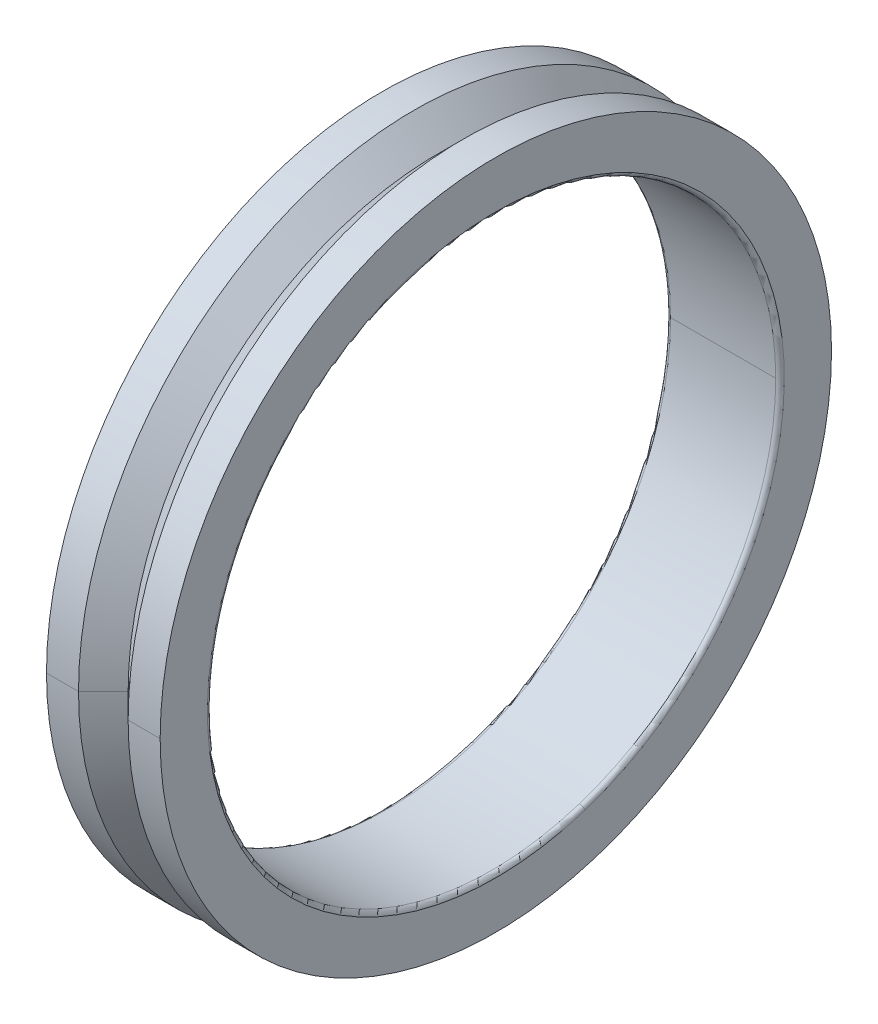
ISO-10303-21;
HEADER;
FILE_DESCRIPTION(('STEP AP214'),'2;1');
FILE_NAME('part.step','',(''),(''),'','','');
FILE_SCHEMA(('AUTOMOTIVE_DESIGN { 1 0 10303 214 1 1 1 1 }'));
ENDSEC;
DATA;
#1=APPLICATION_CONTEXT('core data for automotive mechanical design processes');
#2=APPLICATION_PROTOCOL_DEFINITION('international standard','automotive_design',2000,#1);
#3=PRODUCT_CONTEXT('',#1,'mechanical');
#4=PRODUCT('Part','Part','',(#3));
#5=PRODUCT_RELATED_PRODUCT_CATEGORY('part','',(#4));
#6=PRODUCT_DEFINITION_FORMATION('','',#4);
#7=PRODUCT_DEFINITION_CONTEXT('part definition',#1,'design');
#8=PRODUCT_DEFINITION('design','',#6,#7);
#9=PRODUCT_DEFINITION_SHAPE('','',#8);
#10=(LENGTH_UNIT() NAMED_UNIT(*) SI_UNIT(.MILLI.,.METRE.));
#11=(NAMED_UNIT(*) PLANE_ANGLE_UNIT() SI_UNIT($,.RADIAN.));
#12=(NAMED_UNIT(*) SI_UNIT($,.STERADIAN.) SOLID_ANGLE_UNIT());
#13=UNCERTAINTY_MEASURE_WITH_UNIT(LENGTH_MEASURE(1.E-05),#10,'distance_accuracy_value','');
#14=(GEOMETRIC_REPRESENTATION_CONTEXT(3) GLOBAL_UNCERTAINTY_ASSIGNED_CONTEXT((#13)) GLOBAL_UNIT_ASSIGNED_CONTEXT((#10,
#11,#12)) REPRESENTATION_CONTEXT('',''));
#15=CARTESIAN_POINT('',(0.,0.,0.));
#16=DIRECTION('',(0.,0.,1.));
#17=DIRECTION('',(1.,0.,0.));
#18=AXIS2_PLACEMENT_3D('',#15,#16,#17);
#19=CARTESIAN_POINT('',(16.,0.,0.));
#20=DIRECTION('',(1.,0.,0.));
#21=DIRECTION('',(0.,1.,0.));
#22=AXIS2_PLACEMENT_3D('',#19,#20,#21);
#23=CYLINDRICAL_SURFACE('',#22,47.25);
#24=DIRECTION('',(1.,0.,0.));
#25=VECTOR('',#24,1.);
#26=CARTESIAN_POINT('',(0.,0.,47.25));
#27=LINE('',#26,#25);
#28=CARTESIAN_POINT('',(0.,0.,47.25));
#29=VERTEX_POINT('',#28);
#30=CARTESIAN_POINT('',(4.50735931288075,0.,47.25));
#31=VERTEX_POINT('',#30);
#32=EDGE_CURVE('E10',#29,#31,#27,.T.);
#33=ORIENTED_EDGE('',*,*,#32,.F.);
#34=CARTESIAN_POINT('',(0.,0.,0.));
#35=DIRECTION('',(1.,0.,0.));
#36=DIRECTION('',(0.,0.,-1.));
#37=AXIS2_PLACEMENT_3D('',#34,#35,#36);
#38=CIRCLE('',#37,47.25);
#39=CARTESIAN_POINT('',(0.,0.,-47.25));
#40=VERTEX_POINT('',#39);
#41=EDGE_CURVE('E24',#29,#40,#38,.T.);
#42=ORIENTED_EDGE('',*,*,#41,.T.);
#43=DIRECTION('',(1.,0.,0.));
#44=VECTOR('',#43,1.);
#45=CARTESIAN_POINT('',(0.,0.,-47.25));
#46=LINE('',#45,#44);
#47=CARTESIAN_POINT('',(4.50735931288075,0.,-47.25));
#48=VERTEX_POINT('',#47);
#49=EDGE_CURVE('E303',#40,#48,#46,.T.);
#50=ORIENTED_EDGE('',*,*,#49,.T.);
#51=CARTESIAN_POINT('',(4.50735931288075,0.,0.));
#52=DIRECTION('',(1.,0.,0.));
#53=DIRECTION('',(0.,0.,1.));
#54=AXIS2_PLACEMENT_3D('',#51,#52,#53);
#55=CIRCLE('',#54,47.25);
#56=EDGE_CURVE('E298',#31,#48,#55,.T.);
#57=ORIENTED_EDGE('',*,*,#56,.F.);
#58=EDGE_LOOP('',(#33,#42,#50,#57));
#59=FACE_BOUND('',#58,.T.);
#60=ADVANCED_FACE('F16',(#59),#23,.T.);
#61=CARTESIAN_POINT('',(3.7573593128807,0.,0.));
#62=DIRECTION('',(-1.,0.,0.));
#63=DIRECTION('',(0.,1.,0.));
#64=AXIS2_PLACEMENT_3D('',#61,#62,#63);
#65=CONICAL_SURFACE('',#64,48.,0.785398163397413);
#66=DIRECTION('',(-0.707106781186573,0.,-0.707106781186523));
#67=VECTOR('',#66,1.);
#68=CARTESIAN_POINT('',(8.00000000000001,0.,-43.757359312881));
#69=LINE('',#68,#67);
#70=CARTESIAN_POINT('',(8.,0.,-43.757359312881));
#71=VERTEX_POINT('',#70);
#72=EDGE_CURVE('E293',#71,#48,#69,.T.);
#73=ORIENTED_EDGE('',*,*,#72,.F.);
#74=CARTESIAN_POINT('',(8.,0.,0.));
#75=DIRECTION('',(1.,0.,0.));
#76=DIRECTION('',(0.,0.,-1.));
#77=AXIS2_PLACEMENT_3D('',#74,#75,#76);
#78=CIRCLE('',#77,43.757359312881);
#79=CARTESIAN_POINT('',(8.,0.,43.757359312881));
#80=VERTEX_POINT('',#79);
#81=EDGE_CURVE('E288',#80,#71,#78,.T.);
#82=ORIENTED_EDGE('',*,*,#81,.F.);
#83=DIRECTION('',(-0.707106781186573,0.,0.707106781186523));
#84=VECTOR('',#83,1.);
#85=CARTESIAN_POINT('',(8.,0.,43.757359312881));
#86=LINE('',#85,#84);
#87=EDGE_CURVE('E283',#80,#31,#86,.T.);
#88=ORIENTED_EDGE('',*,*,#87,.T.);
#89=ORIENTED_EDGE('',*,*,#56,.T.);
#90=EDGE_LOOP('',(#73,#82,#88,#89));
#91=FACE_BOUND('',#90,.T.);
#92=ADVANCED_FACE('F321',(#91),#65,.T.);
#93=CARTESIAN_POINT('',(3.7573593128807,0.,0.));
#94=DIRECTION('',(-1.,0.,0.));
#95=DIRECTION('',(0.,-1.,0.));
#96=AXIS2_PLACEMENT_3D('',#93,#94,#95);
#97=CONICAL_SURFACE('',#96,48.,0.785398163397413);
#98=ORIENTED_EDGE('',*,*,#72,.T.);
#99=CARTESIAN_POINT('',(4.50735931288075,0.,0.));
#100=DIRECTION('',(1.,0.,0.));
#101=DIRECTION('',(0.,0.,1.));
#102=AXIS2_PLACEMENT_3D('',#99,#100,#101);
#103=CIRCLE('',#102,47.25);
#104=EDGE_CURVE('E278',#48,#31,#103,.T.);
#105=ORIENTED_EDGE('',*,*,#104,.T.);
#106=ORIENTED_EDGE('',*,*,#87,.F.);
#107=CARTESIAN_POINT('',(8.,0.,0.));
#108=DIRECTION('',(1.,0.,0.));
#109=DIRECTION('',(0.,0.,-1.));
#110=AXIS2_PLACEMENT_3D('',#107,#108,#109);
#111=CIRCLE('',#110,43.757359312881);
#112=EDGE_CURVE('E273',#71,#80,#111,.T.);
#113=ORIENTED_EDGE('',*,*,#112,.F.);
#114=EDGE_LOOP('',(#98,#105,#106,#113));
#115=FACE_BOUND('',#114,.T.);
#116=ADVANCED_FACE('F318',(#115),#97,.T.);
#117=CARTESIAN_POINT('',(8.,0.,0.));
#118=DIRECTION('',(1.,0.,0.));
#119=DIRECTION('',(0.,-1.,0.));
#120=AXIS2_PLACEMENT_3D('',#117,#118,#119);
#121=CONICAL_SURFACE('',#120,43.757359312881,0.785398163397448);
#122=DIRECTION('',(0.707106781186548,0.,0.707106781186548));
#123=VECTOR('',#122,1.);
#124=CARTESIAN_POINT('',(7.99999999999999,0.,43.757359312881));
#125=LINE('',#124,#123);
#126=CARTESIAN_POINT('',(11.492640687119,0.,47.25));
#127=VERTEX_POINT('',#126);
#128=EDGE_CURVE('E269',#80,#127,#125,.T.);
#129=ORIENTED_EDGE('',*,*,#128,.T.);
#130=CARTESIAN_POINT('',(11.492640687119,0.,0.));
#131=DIRECTION('',(-1.,0.,0.));
#132=DIRECTION('',(0.,0.,-1.));
#133=AXIS2_PLACEMENT_3D('',#130,#131,#132);
#134=CIRCLE('',#133,47.25);
#135=CARTESIAN_POINT('',(11.492640687119,0.,-47.25));
#136=VERTEX_POINT('',#135);
#137=EDGE_CURVE('E265',#127,#136,#134,.T.);
#138=ORIENTED_EDGE('',*,*,#137,.T.);
#139=DIRECTION('',(0.707106781186548,0.,-0.707106781186548));
#140=VECTOR('',#139,1.);
#141=CARTESIAN_POINT('',(7.99999999999999,0.,-43.757359312881));
#142=LINE('',#141,#140);
#143=EDGE_CURVE('E260',#71,#136,#142,.T.);
#144=ORIENTED_EDGE('',*,*,#143,.F.);
#145=ORIENTED_EDGE('',*,*,#112,.T.);
#146=EDGE_LOOP('',(#129,#138,#144,#145));
#147=FACE_BOUND('',#146,.T.);
#148=ADVANCED_FACE('F324',(#147),#121,.T.);
#149=CARTESIAN_POINT('',(8.,0.,0.));
#150=DIRECTION('',(1.,0.,0.));
#151=DIRECTION('',(0.,1.,0.));
#152=AXIS2_PLACEMENT_3D('',#149,#150,#151);
#153=CONICAL_SURFACE('',#152,43.757359312881,0.785398163397448);
#154=ORIENTED_EDGE('',*,*,#128,.F.);
#155=ORIENTED_EDGE('',*,*,#81,.T.);
#156=ORIENTED_EDGE('',*,*,#143,.T.);
#157=CARTESIAN_POINT('',(11.492640687119,0.,0.));
#158=DIRECTION('',(-1.,0.,0.));
#159=DIRECTION('',(0.,0.,-1.));
#160=AXIS2_PLACEMENT_3D('',#157,#158,#159);
#161=CIRCLE('',#160,47.25);
#162=EDGE_CURVE('E255',#136,#127,#161,.T.);
#163=ORIENTED_EDGE('',*,*,#162,.T.);
#164=EDGE_LOOP('',(#154,#155,#156,#163));
#165=FACE_BOUND('',#164,.T.);
#166=ADVANCED_FACE('F326',(#165),#153,.T.);
#167=CARTESIAN_POINT('',(16.,0.,0.));
#168=DIRECTION('',(1.,0.,0.));
#169=DIRECTION('',(0.,1.,0.));
#170=AXIS2_PLACEMENT_3D('',#167,#168,#169);
#171=CYLINDRICAL_SURFACE('',#170,47.25);
#172=DIRECTION('',(1.,0.,0.));
#173=VECTOR('',#172,1.);
#174=CARTESIAN_POINT('',(11.492640687119,0.,47.25));
#175=LINE('',#174,#173);
#176=CARTESIAN_POINT('',(16.,0.,47.25));
#177=VERTEX_POINT('',#176);
#178=EDGE_CURVE('E250',#127,#177,#175,.T.);
#179=ORIENTED_EDGE('',*,*,#178,.F.);
#180=ORIENTED_EDGE('',*,*,#162,.F.);
#181=DIRECTION('',(1.,0.,0.));
#182=VECTOR('',#181,1.);
#183=CARTESIAN_POINT('',(11.492640687119,0.,-47.25));
#184=LINE('',#183,#182);
#185=CARTESIAN_POINT('',(16.,0.,-47.25));
#186=VERTEX_POINT('',#185);
#187=EDGE_CURVE('E246',#136,#186,#184,.T.);
#188=ORIENTED_EDGE('',*,*,#187,.T.);
#189=CARTESIAN_POINT('',(16.,0.,0.));
#190=DIRECTION('',(1.,0.,0.));
#191=DIRECTION('',(0.,0.,-1.));
#192=AXIS2_PLACEMENT_3D('',#189,#190,#191);
#193=CIRCLE('',#192,47.25);
#194=EDGE_CURVE('E241',#177,#186,#193,.T.);
#195=ORIENTED_EDGE('',*,*,#194,.F.);
#196=EDGE_LOOP('',(#179,#180,#188,#195));
#197=FACE_BOUND('',#196,.T.);
#198=ADVANCED_FACE('F331',(#197),#171,.T.);
#199=CARTESIAN_POINT('',(16.,40.6,0.));
#200=DIRECTION('',(1.,0.,0.));
#201=DIRECTION('',(0.,0.,-1.));
#202=AXIS2_PLACEMENT_3D('',#199,#200,#201);
#203=PLANE('',#202);
#204=CARTESIAN_POINT('',(16.,0.,0.));
#205=DIRECTION('',(1.,0.,0.));
#206=DIRECTION('',(0.,0.,-1.));
#207=AXIS2_PLACEMENT_3D('',#204,#205,#206);
#208=CIRCLE('',#207,47.25);
#209=EDGE_CURVE('E238',#186,#177,#208,.T.);
#210=ORIENTED_EDGE('',*,*,#209,.T.);
#211=ORIENTED_EDGE('',*,*,#194,.T.);
#212=EDGE_LOOP('',(#210,#211));
#213=FACE_BOUND('',#212,.T.);
#214=CARTESIAN_POINT('',(16.,-38.6128945615832,-12.5460899716229));
#215=CARTESIAN_POINT('',(16.,-38.4076228392656,-13.1778969740839));
#216=CARTESIAN_POINT('',(16.,-38.1868184060737,-13.8046558320644));
#217=CARTESIAN_POINT('',(16.,-37.7147339583836,-15.0465893519055));
#218=CARTESIAN_POINT('',(16.,-37.4634539438855,-15.6617640137662));
#219=CARTESIAN_POINT('',(16.,-36.9310081740259,-16.8790412342089));
#220=CARTESIAN_POINT('',(16.,-36.6498424186643,-17.4811437927909));
#221=CARTESIAN_POINT('',(16.,-36.0583066772739,-18.6708278691092));
#222=CARTESIAN_POINT('',(16.,-35.747936691245,-19.2584093868455));
#223=CARTESIAN_POINT('',(16.,-35.098739083066,-20.4176354227074));
#224=CARTESIAN_POINT('',(16.,-34.7599114609159,-20.989279940833));
#225=CARTESIAN_POINT('',(16.,-34.0546151443919,-22.1152549492152));
#226=CARTESIAN_POINT('',(16.,-33.6881464500181,-22.6695854394717));
#227=CARTESIAN_POINT('',(16.,-32.9284507642535,-23.7595969310105));
#228=CARTESIAN_POINT('',(16.,-32.5352237728628,-24.2952779322928));
#229=CARTESIAN_POINT('',(16.,-31.7229588327588,-25.3466999515768));
#230=CARTESIAN_POINT('',(16.,-31.3039208840457,-25.8624409695784));
#231=CARTESIAN_POINT('',(16.,-30.4410435226768,-26.8727405548325));
#232=CARTESIAN_POINT('',(16.,-29.997204110021,-27.367299122085));
#233=CARTESIAN_POINT('',(16.,-29.0857930703264,-28.3340423715187));
#234=CARTESIAN_POINT('',(16.,-28.6182214432875,-28.8062270537001));
#235=CARTESIAN_POINT('',(16.,-27.6604723954181,-29.727084998577));
#236=CARTESIAN_POINT('',(16.,-27.1702949745877,-30.1757582612726));
#237=CARTESIAN_POINT('',(16.,-26.1685152195872,-31.0485124740312));
#238=CARTESIAN_POINT('',(16.,-25.656912885417,-31.4725934240942));
#239=CARTESIAN_POINT('',(16.,-24.6135157985414,-32.2951413634224));
#240=CARTESIAN_POINT('',(16.,-24.081721045836,-32.6936083526876));
#241=CARTESIAN_POINT('',(16.,-22.9992202620368,-33.4639684285446));
#242=CARTESIAN_POINT('',(16.,-22.4485142309431,-33.8358615151364));
#243=CARTESIAN_POINT('',(16.,-21.3295175894301,-34.5521778626261));
#244=CARTESIAN_POINT('',(16.,-20.7612269790109,-34.8966011235241));
#245=CARTESIAN_POINT('',(16.,-19.6084302407046,-35.5571480738229));
#246=CARTESIAN_POINT('',(16.,-19.0239241128174,-35.8732717632238));
#247=CARTESIAN_POINT('',(16.,-17.8401044660337,-36.4764580008716));
#248=CARTESIAN_POINT('',(16.,-17.2407909471372,-36.7635205491185));
#249=CARTESIAN_POINT('',(16.,-16.0288003170956,-37.3078929456359));
#250=CARTESIAN_POINT('',(16.,-15.4161232059505,-37.5652027939063));
#251=CARTESIAN_POINT('',(16.,-14.1788813842365,-38.0494499085086));
#252=CARTESIAN_POINT('',(16.,-13.5543166736676,-38.2763871748404));
#253=CARTESIAN_POINT('',(16.,-12.2948042841994,-38.6993424138135));
#254=CARTESIAN_POINT('',(16.,-11.6598566053,-38.8953603864547));
#255=CARTESIAN_POINT('',(16.,-10.381107923744,-39.2560048135814));
#256=CARTESIAN_POINT('',(16.,-9.73730692108741,-39.4206312680669));
#257=CARTESIAN_POINT('',(16.,-8.44240256502268,-39.7180960593336));
#258=CARTESIAN_POINT('',(16.,-7.79129921161455,-39.8509343961148));
#259=CARTESIAN_POINT('',(16.,-6.48335871905507,-40.0845029327844));
#260=CARTESIAN_POINT('',(16.,-5.8265215799037,-40.1852331326728));
#261=CARTESIAN_POINT('',(16.,-4.50869589405809,-40.3543427276824));
#262=CARTESIAN_POINT('',(16.,-3.84770734736384,-40.4227221228036));
#263=CARTESIAN_POINT('',(16.,-2.5231712257372,-40.5269653763264));
#264=CARTESIAN_POINT('',(16.,-1.8596236508048,-40.5628292347282));
#265=CARTESIAN_POINT('',(16.,-0.531568016929813,-40.601955015636));
#266=CARTESIAN_POINT('',(16.,0.132940042012787,-40.6052169381421));
#267=CARTESIAN_POINT('',(16.,1.4613157857902,-40.5791309890016));
#268=CARTESIAN_POINT('',(16.,2.12518347062501,-40.549783117355));
#269=CARTESIAN_POINT('',(16.,3.45067915078611,-40.4585482815026));
#270=CARTESIAN_POINT('',(16.,4.11230714611239,-40.3966613172968));
#271=CARTESIAN_POINT('',(16.,5.43172952746396,-40.2404973874432));
#272=CARTESIAN_POINT('',(16.,6.08952391348923,-40.1462204217955));
#273=CARTESIAN_POINT('',(16.,7.39969439194684,-39.9255036105262));
#274=CARTESIAN_POINT('',(16.,8.05207048437919,-39.7990637649046));
#275=CARTESIAN_POINT('',(16.,9.34983274450286,-39.5143257983503));
#276=CARTESIAN_POINT('',(16.,9.99521891219419,-39.3560276774177));
#277=CARTESIAN_POINT('',(16.,11.2774465310287,-39.00795451428));
#278=CARTESIAN_POINT('',(16.,11.9142879821719,-38.818179472075));
#279=CARTESIAN_POINT('',(16.,13.1778919610737,-38.4076096510915));
#280=CARTESIAN_POINT('',(16.,13.8046544888323,-38.1868148723131));
#281=CARTESIAN_POINT('',(16.,15.0465906951374,-37.7147374921443));
#282=CARTESIAN_POINT('',(16.,15.6617643736841,-37.4634548907539));
#283=CARTESIAN_POINT('',(16.,16.8790408742909,-36.9310072271576));
#284=CARTESIAN_POINT('',(16.,17.4811436963511,-36.6498421649517));
#285=CARTESIAN_POINT('',(16.,18.6708279655488,-36.0583069309865));
#286=CARTESIAN_POINT('',(16.,19.2584094126863,-35.7479367592272));
#287=CARTESIAN_POINT('',(16.,20.4176353968663,-35.098739015084));
#288=CARTESIAN_POINT('',(16.,20.9892799339089,-34.7599114427002));
#289=CARTESIAN_POINT('',(16.,22.1152549561392,-34.0546151626077));
#290=CARTESIAN_POINT('',(16.,22.6695854413269,-33.6881464548991));
#291=CARTESIAN_POINT('',(16.,23.7595969291551,-32.9284507593727));
#292=CARTESIAN_POINT('',(16.,24.2952779317956,-32.535223771555));
#293=CARTESIAN_POINT('',(16.,25.3466999520738,-31.7229588340667));
#294=CARTESIAN_POINT('',(16.,25.8624409697116,-31.3039208843962));
#295=CARTESIAN_POINT('',(16.,26.8727405546993,-30.4410435223264));
#296=CARTESIAN_POINT('',(16.,27.3672991220492,-29.9972041099272));
#297=CARTESIAN_POINT('',(16.,28.3340423715543,-29.0857930704204));
#298=CARTESIAN_POINT('',(16.,28.8062270537095,-28.6182214433127));
#299=CARTESIAN_POINT('',(16.,29.7270849985674,-27.6604723953931));
#300=CARTESIAN_POINT('',(16.,30.17575826127,-27.1702949745811));
#301=CARTESIAN_POINT('',(16.,31.0485124740337,-26.168515219594));
#302=CARTESIAN_POINT('',(16.,31.4725934240948,-25.6569128854189));
#303=CARTESIAN_POINT('',(16.,32.2951413634216,-24.6135157985397));
#304=CARTESIAN_POINT('',(16.,32.6936083526873,-24.0817210458356));
#305=CARTESIAN_POINT('',(16.,33.4639684285447,-22.9992202620374));
#306=CARTESIAN_POINT('',(16.,33.8358615151364,-22.4485142309433));
#307=CARTESIAN_POINT('',(16.,34.552177862626,-21.3295175894301));
#308=CARTESIAN_POINT('',(16.,34.896601123524,-20.761226979011));
#309=CARTESIAN_POINT('',(16.,35.5571480738229,-19.6084302407047));
#310=CARTESIAN_POINT('',(16.,35.8732717632238,-19.0239241128175));
#311=CARTESIAN_POINT('',(16.,36.4764580008716,-17.8401044660338));
#312=CARTESIAN_POINT('',(16.,36.7635205491184,-17.2407909471373));
#313=CARTESIAN_POINT('',(16.,37.3078929456358,-16.0288003170957));
#314=CARTESIAN_POINT('',(16.,37.5652027939064,-15.4161232059505));
#315=CARTESIAN_POINT('',(16.,38.0494499085084,-14.1788813842366));
#316=CARTESIAN_POINT('',(16.,38.2763871748398,-13.5543166736679));
#317=CARTESIAN_POINT('',(16.,38.6993424138139,-12.2948042841994));
#318=CARTESIAN_POINT('',(16.,38.8953603864566,-11.6598566052996));
#319=CARTESIAN_POINT('',(16.,39.2560048135795,-10.3811079237446));
#320=CARTESIAN_POINT('',(16.,39.4206312680599,-9.73730692108941));
#321=CARTESIAN_POINT('',(16.,39.7180960593405,-8.4424025650209));
#322=CARTESIAN_POINT('',(16.,39.8509343961407,-7.79129921160761));
#323=CARTESIAN_POINT('',(16.,40.0845029327584,-6.48335871906223));
#324=CARTESIAN_POINT('',(16.,40.1852331325759,-5.82652157993013));
#325=CARTESIAN_POINT('',(16.,40.3543427277793,-4.50869589403189));
#326=CARTESIAN_POINT('',(16.,40.4227221231654,-3.84770734726574));
#327=CARTESIAN_POINT('',(16.,40.5269653759646,-2.52317122583554));
#328=CARTESIAN_POINT('',(16.,40.5628292333779,-1.85962365117148));
#329=CARTESIAN_POINT('',(16.,40.6019550169862,-0.531568016563413));
#330=CARTESIAN_POINT('',(16.,40.6052169431813,0.132940043380602));
#331=CARTESIAN_POINT('',(16.,40.5791309839624,1.46131578442211));
#332=CARTESIAN_POINT('',(16.,40.5497830985483,2.1251834655196));
#333=CARTESIAN_POINT('',(16.,40.4585483003094,3.45067915589124));
#334=CARTESIAN_POINT('',(16.,40.3966613874844,4.11230716516539));
#335=CARTESIAN_POINT('',(16.,40.2404973172557,5.43172950841076));
#336=CARTESIAN_POINT('',(16.,40.1462201598519,6.08952384238199));
#337=CARTESIAN_POINT('',(16.,39.9255038724699,7.3996944630539));
#338=CARTESIAN_POINT('',(16.,39.7990647424916,8.05207074975459));
#339=CARTESIAN_POINT('',(16.,39.5143248207633,9.34983247912725));
#340=CARTESIAN_POINT('',(16.,39.3560240290133,9.99521792179923));
#341=CARTESIAN_POINT('',(16.,39.0079581626844,11.2774475214235));
#342=CARTESIAN_POINT('',(16.,38.8181930881054,11.9142916783758));
#343=CARTESIAN_POINT('',(16.,38.6128945615833,12.5460899716227));
#344=B_SPLINE_CURVE_WITH_KNOTS('',3,(#214,#215,#216,#217,#218,#219,#220,#221,#222,#223,#224,
#225,#226,#227,#228,#229,#230,#231,#232,#233,#234,#235,#236,#237,#238,#239,#240,#241,#242,#243,
#244,#245,#246,#247,#248,#249,#250,#251,#252,#253,#254,#255,#256,#257,#258,#259,#260,#261,#262,
#263,#264,#265,#266,#267,#268,#269,#270,#271,#272,#273,#274,#275,#276,#277,#278,#279,#280,#281,
#282,#283,#284,#285,#286,#287,#288,#289,#290,#291,#292,#293,#294,#295,#296,#297,#298,#299,#300,
#301,#302,#303,#304,#305,#306,#307,#308,#309,#310,#311,#312,#313,#314,#315,#316,#317,#318,#319,
#320,#321,#322,#323,#324,#325,#326,#327,#328,#329,#330,#331,#332,#333,#334,#335,#336,#337,#338,
#339,#340,#341,#342,#343),.UNSPECIFIED.,.F.,.F.,(4,2,2,2,2,2,2,2,2,2,2,2,2,2,2,2,2,2,2,2,2,2,2,
2,2,2,2,2,2,2,2,2,2,2,2,2,2,2,2,2,2,2,2,2,2,2,2,2,2,2,2,2,2,2,2,2,2,2,2,2,2,2,2,2,4),(0.,
1.99274775606047,3.98549551212095,5.97824326818142,7.97099102424189,9.96373878030237,
11.9564865363628,13.9492342924233,15.9419820484838,17.9347298045443,19.9274775606047,
21.9202253166652,23.9129730727257,25.9057208287862,27.8984685848466,29.8912163409071,
31.8839640969676,33.8767118530281,35.8694596090885,37.862207365149,39.8549551212095,
41.84770287727,43.8404506333304,45.8331983893909,47.8259461454514,49.8186939015119,
51.8114416575723,53.8041894136328,55.7969371696933,57.7896849257537,59.7824326818142,
61.7751804378747,63.7679281939352,65.7606759499956,67.7534237060561,69.7461714621166,
71.7389192181771,73.7316669742375,75.724414730298,77.7171624863585,79.709910242419,
81.7026579984794,83.6954057545399,85.6881535106004,87.6809012666608,89.6736490227213,
91.6663967787818,93.6591445348422,95.6518922909027,97.6446400469632,99.6373878030237,
101.630135559084,103.622883315145,105.615631071205,107.608378827266,109.601126583326,
111.593874339387,113.586622095447,115.579369851507,117.572117607568,119.564865363628,
121.557613119689,123.550360875749,125.54310863181,127.53585638787),.UNSPECIFIED.);
#345=CARTESIAN_POINT('',(16.,-38.6128945615832,-12.5460899716229));
#346=VERTEX_POINT('',#345);
#347=CARTESIAN_POINT('',(16.,38.6128945615832,12.5460899716229));
#348=VERTEX_POINT('',#347);
#349=EDGE_CURVE('E237',#346,#348,#344,.T.);
#350=ORIENTED_EDGE('',*,*,#349,.F.);
#351=CARTESIAN_POINT('',(16.,38.6128945615832,12.5460899716229));
#352=CARTESIAN_POINT('',(16.,38.4076228392656,13.1778969740839));
#353=CARTESIAN_POINT('',(16.,38.1868184060737,13.8046558320644));
#354=CARTESIAN_POINT('',(16.,37.7147339583836,15.0465893519055));
#355=CARTESIAN_POINT('',(16.,37.4634539438855,15.6617640137662));
#356=CARTESIAN_POINT('',(16.,36.9310081740259,16.8790412342089));
#357=CARTESIAN_POINT('',(16.,36.6498424186643,17.4811437927909));
#358=CARTESIAN_POINT('',(16.,36.0583066772739,18.6708278691092));
#359=CARTESIAN_POINT('',(16.,35.747936691245,19.2584093868455));
#360=CARTESIAN_POINT('',(16.,35.098739083066,20.4176354227074));
#361=CARTESIAN_POINT('',(16.,34.7599114609159,20.9892799408331));
#362=CARTESIAN_POINT('',(16.,34.0546151443919,22.1152549492152));
#363=CARTESIAN_POINT('',(16.,33.6881464500181,22.6695854394717));
#364=CARTESIAN_POINT('',(16.,32.9284507642535,23.7595969310105));
#365=CARTESIAN_POINT('',(16.,32.5352237728627,24.2952779322928));
#366=CARTESIAN_POINT('',(16.,31.7229588327588,25.3466999515768));
#367=CARTESIAN_POINT('',(16.,31.3039208840457,25.8624409695785));
#368=CARTESIAN_POINT('',(16.,30.4410435226768,26.8727405548326));
#369=CARTESIAN_POINT('',(16.,29.997204110021,27.367299122085));
#370=CARTESIAN_POINT('',(16.,29.0857930703264,28.3340423715187));
#371=CARTESIAN_POINT('',(16.,28.6182214432874,28.8062270537001));
#372=CARTESIAN_POINT('',(16.,27.6604723954181,29.727084998577));
#373=CARTESIAN_POINT('',(16.,27.1702949745877,30.1757582612726));
#374=CARTESIAN_POINT('',(16.,26.1685152195872,31.0485124740312));
#375=CARTESIAN_POINT('',(16.,25.656912885417,31.4725934240942));
#376=CARTESIAN_POINT('',(16.,24.6135157985414,32.2951413634224));
#377=CARTESIAN_POINT('',(16.,24.081721045836,32.6936083526876));
#378=CARTESIAN_POINT('',(16.,22.9992202620368,33.4639684285446));
#379=CARTESIAN_POINT('',(16.,22.448514230943,33.8358615151364));
#380=CARTESIAN_POINT('',(16.,21.3295175894301,34.5521778626261));
#381=CARTESIAN_POINT('',(16.,20.7612269790109,34.8966011235241));
#382=CARTESIAN_POINT('',(16.,19.6084302407046,35.5571480738229));
#383=CARTESIAN_POINT('',(16.,19.0239241128174,35.8732717632239));
#384=CARTESIAN_POINT('',(16.,17.8401044660337,36.4764580008717));
#385=CARTESIAN_POINT('',(16.,17.2407909471372,36.7635205491185));
#386=CARTESIAN_POINT('',(16.,16.0288003170956,37.3078929456359));
#387=CARTESIAN_POINT('',(16.,15.4161232059504,37.5652027939063));
#388=CARTESIAN_POINT('',(16.,14.1788813842364,38.0494499085086));
#389=CARTESIAN_POINT('',(16.,13.5543166736676,38.2763871748404));
#390=CARTESIAN_POINT('',(16.,12.2948042841994,38.6993424138135));
#391=CARTESIAN_POINT('',(16.,11.6598566053,38.8953603864547));
#392=CARTESIAN_POINT('',(16.,10.381107923744,39.2560048135814));
#393=CARTESIAN_POINT('',(16.,9.73730692108737,39.4206312680669));
#394=CARTESIAN_POINT('',(16.,8.44240256502263,39.7180960593336));
#395=CARTESIAN_POINT('',(16.,7.79129921161449,39.8509343961148));
#396=CARTESIAN_POINT('',(16.,6.48335871905499,40.0845029327844));
#397=CARTESIAN_POINT('',(16.,5.82652157990363,40.1852331326728));
#398=CARTESIAN_POINT('',(16.,4.50869589405802,40.3543427276824));
#399=CARTESIAN_POINT('',(16.,3.84770734736377,40.4227221228036));
#400=CARTESIAN_POINT('',(16.,2.52317122573714,40.5269653763264));
#401=CARTESIAN_POINT('',(16.,1.85962365080476,40.5628292347282));
#402=CARTESIAN_POINT('',(16.,0.531568016929769,40.601955015636));
#403=CARTESIAN_POINT('',(16.,-0.132940042012837,40.6052169381421));
#404=CARTESIAN_POINT('',(16.,-1.46131578579025,40.5791309890016));
#405=CARTESIAN_POINT('',(16.,-2.12518347062505,40.549783117355));
#406=CARTESIAN_POINT('',(16.,-3.45067915078615,40.4585482815026));
#407=CARTESIAN_POINT('',(16.,-4.11230714611244,40.3966613172968));
#408=CARTESIAN_POINT('',(16.,-5.43172952746401,40.2404973874432));
#409=CARTESIAN_POINT('',(16.,-6.08952391348929,40.1462204217955));
#410=CARTESIAN_POINT('',(16.,-7.3996943919469,39.9255036105262));
#411=CARTESIAN_POINT('',(16.,-8.05207048437924,39.7990637649046));
#412=CARTESIAN_POINT('',(16.,-9.34983274450292,39.5143257983503));
#413=CARTESIAN_POINT('',(16.,-9.99521891219426,39.3560276774176));
#414=CARTESIAN_POINT('',(16.,-11.2774465310288,39.00795451428));
#415=CARTESIAN_POINT('',(16.,-11.914287982172,38.818179472075));
#416=CARTESIAN_POINT('',(16.,-13.1778919610738,38.4076096510915));
#417=CARTESIAN_POINT('',(16.,-13.8046544888323,38.1868148723131));
#418=CARTESIAN_POINT('',(16.,-15.0465906951375,37.7147374921443));
#419=CARTESIAN_POINT('',(16.,-15.6617643736841,37.4634548907539));
#420=CARTESIAN_POINT('',(16.,-16.879040874291,36.9310072271576));
#421=CARTESIAN_POINT('',(16.,-17.4811436963512,36.6498421649517));
#422=CARTESIAN_POINT('',(16.,-18.6708279655489,36.0583069309865));
#423=CARTESIAN_POINT('',(16.,-19.2584094126864,35.7479367592271));
#424=CARTESIAN_POINT('',(16.,-20.4176353968664,35.098739015084));
#425=CARTESIAN_POINT('',(16.,-20.9892799339089,34.7599114427002));
#426=CARTESIAN_POINT('',(16.,-22.1152549561392,34.0546151626077));
#427=CARTESIAN_POINT('',(16.,-22.669585441327,33.688146454899));
#428=CARTESIAN_POINT('',(16.,-23.7595969291552,32.9284507593727));
#429=CARTESIAN_POINT('',(16.,-24.2952779317957,32.5352237715549));
#430=CARTESIAN_POINT('',(16.,-25.3466999520739,31.7229588340667));
#431=CARTESIAN_POINT('',(16.,-25.8624409697116,31.3039208843961));
#432=CARTESIAN_POINT('',(16.,-26.8727405546993,30.4410435223264));
#433=CARTESIAN_POINT('',(16.,-27.3672991220493,29.9972041099272));
#434=CARTESIAN_POINT('',(16.,-28.3340423715544,29.0857930704203));
#435=CARTESIAN_POINT('',(16.,-28.8062270537096,28.6182214433126));
#436=CARTESIAN_POINT('',(16.,-29.7270849985674,27.660472395393));
#437=CARTESIAN_POINT('',(16.,-30.17575826127,27.170294974581));
#438=CARTESIAN_POINT('',(16.,-31.0485124740337,26.168515219594));
#439=CARTESIAN_POINT('',(16.,-31.4725934240948,25.6569128854189));
#440=CARTESIAN_POINT('',(16.,-32.2951413634216,24.6135157985397));
#441=CARTESIAN_POINT('',(16.,-32.6936083526874,24.0817210458356));
#442=CARTESIAN_POINT('',(16.,-33.4639684285448,22.9992202620374));
#443=CARTESIAN_POINT('',(16.,-33.8358615151364,22.4485142309432));
#444=CARTESIAN_POINT('',(16.,-34.552177862626,21.32951758943));
#445=CARTESIAN_POINT('',(16.,-34.896601123524,20.7612269790109));
#446=CARTESIAN_POINT('',(16.,-35.5571480738229,19.6084302407046));
#447=CARTESIAN_POINT('',(16.,-35.8732717632238,19.0239241128174));
#448=CARTESIAN_POINT('',(16.,-36.4764580008716,17.8401044660338));
#449=CARTESIAN_POINT('',(16.,-36.7635205491185,17.2407909471373));
#450=CARTESIAN_POINT('',(16.,-37.3078929456359,16.0288003170956));
#451=CARTESIAN_POINT('',(16.,-37.5652027939064,15.4161232059505));
#452=CARTESIAN_POINT('',(16.,-38.0494499085084,14.1788813842365));
#453=CARTESIAN_POINT('',(16.,-38.2763871748399,13.5543166736678));
#454=CARTESIAN_POINT('',(16.,-38.699342413814,12.2948042841993));
#455=CARTESIAN_POINT('',(16.,-38.8953603864566,11.6598566052995));
#456=CARTESIAN_POINT('',(16.,-39.2560048135796,10.3811079237445));
#457=CARTESIAN_POINT('',(16.,-39.4206312680599,9.7373069210893));
#458=CARTESIAN_POINT('',(16.,-39.7180960593405,8.44240256502078));
#459=CARTESIAN_POINT('',(16.,-39.8509343961408,7.7912992116075));
#460=CARTESIAN_POINT('',(16.,-40.0845029327584,6.48335871906211));
#461=CARTESIAN_POINT('',(16.,-40.1852331325759,5.82652157993002));
#462=CARTESIAN_POINT('',(16.,-40.3543427277793,4.50869589403178));
#463=CARTESIAN_POINT('',(16.,-40.4227221231654,3.84770734726563));
#464=CARTESIAN_POINT('',(16.,-40.5269653759646,2.52317122583543));
#465=CARTESIAN_POINT('',(16.,-40.5628292333779,1.85962365117137));
#466=CARTESIAN_POINT('',(16.,-40.6019550169862,0.5315680165633));
#467=CARTESIAN_POINT('',(16.,-40.6052169431813,-0.132940043380715));
#468=CARTESIAN_POINT('',(16.,-40.5791309839624,-1.46131578442222));
#469=CARTESIAN_POINT('',(16.,-40.5497830985483,-2.12518346551971));
#470=CARTESIAN_POINT('',(16.,-40.4585483003093,-3.45067915589135));
#471=CARTESIAN_POINT('',(16.,-40.3966613874844,-4.1123071651655));
#472=CARTESIAN_POINT('',(16.,-40.2404973172556,-5.43172950841087));
#473=CARTESIAN_POINT('',(16.,-40.1462201598519,-6.0895238423821));
#474=CARTESIAN_POINT('',(16.,-39.9255038724698,-7.39969446305401));
#475=CARTESIAN_POINT('',(16.,-39.7990647424916,-8.0520707497547));
#476=CARTESIAN_POINT('',(16.,-39.5143248207633,-9.34983247912736));
#477=CARTESIAN_POINT('',(16.,-39.3560240290133,-9.99521792179933));
#478=CARTESIAN_POINT('',(16.,-39.0079581626843,-11.2774475214236));
#479=CARTESIAN_POINT('',(16.,-38.8181930881054,-11.9142916783759));
#480=CARTESIAN_POINT('',(16.,-38.6128945615832,-12.5460899716228));
#481=B_SPLINE_CURVE_WITH_KNOTS('',3,(#351,#352,#353,#354,#355,#356,#357,#358,#359,#360,#361,
#362,#363,#364,#365,#366,#367,#368,#369,#370,#371,#372,#373,#374,#375,#376,#377,#378,#379,#380,
#381,#382,#383,#384,#385,#386,#387,#388,#389,#390,#391,#392,#393,#394,#395,#396,#397,#398,#399,
#400,#401,#402,#403,#404,#405,#406,#407,#408,#409,#410,#411,#412,#413,#414,#415,#416,#417,#418,
#419,#420,#421,#422,#423,#424,#425,#426,#427,#428,#429,#430,#431,#432,#433,#434,#435,#436,#437,
#438,#439,#440,#441,#442,#443,#444,#445,#446,#447,#448,#449,#450,#451,#452,#453,#454,#455,#456,
#457,#458,#459,#460,#461,#462,#463,#464,#465,#466,#467,#468,#469,#470,#471,#472,#473,#474,#475,
#476,#477,#478,#479,#480),.UNSPECIFIED.,.F.,.F.,(4,2,2,2,2,2,2,2,2,2,2,2,2,2,2,2,2,2,2,2,2,2,2,
2,2,2,2,2,2,2,2,2,2,2,2,2,2,2,2,2,2,2,2,2,2,2,2,2,2,2,2,2,2,2,2,2,2,2,2,2,2,2,2,2,4),(0.,
1.99274775606047,3.98549551212095,5.97824326818142,7.9709910242419,9.96373878030237,
11.9564865363629,13.9492342924233,15.9419820484838,17.9347298045443,19.9274775606048,
21.9202253166652,23.9129730727257,25.9057208287862,27.8984685848467,29.8912163409071,
31.8839640969676,33.8767118530281,35.8694596090886,37.8622073651491,39.8549551212095,
41.84770287727,43.8404506333305,45.833198389391,47.8259461454514,49.8186939015119,
51.8114416575724,53.8041894136329,55.7969371696933,57.7896849257538,59.7824326818143,
61.7751804378748,63.7679281939352,65.7606759499957,67.7534237060562,69.7461714621166,
71.7389192181771,73.7316669742376,75.7244147302981,77.7171624863586,79.709910242419,
81.7026579984795,83.69540575454,85.6881535106004,87.6809012666609,89.6736490227214,
91.6663967787819,93.6591445348423,95.6518922909028,97.6446400469633,99.6373878030238,
101.630135559084,103.622883315145,105.615631071205,107.608378827266,109.601126583326,
111.593874339387,113.586622095447,115.579369851508,117.572117607568,119.564865363629,
121.557613119689,123.550360875749,125.54310863181,127.53585638787),.UNSPECIFIED.);
#482=EDGE_CURVE('E200',#348,#346,#481,.T.);
#483=ORIENTED_EDGE('',*,*,#482,.F.);
#484=EDGE_LOOP('',(#350,#483));
#485=FACE_BOUND('',#484,.T.);
#486=ADVANCED_FACE('F185',(#213,#485),#203,.T.);
#487=CARTESIAN_POINT('',(15.4000000000003,0.,0.));
#488=DIRECTION('',(1.,0.,0.));
#489=DIRECTION('',(0.,0.309016994374947,-0.951056516295154));
#490=AXIS2_PLACEMENT_3D('',#487,#488,#489);
#491=TOROIDAL_SURFACE('',#490,40.6,0.59999999999976);
#492=CARTESIAN_POINT('',(15.4000000000003,-38.6128945615832,-12.5460899716229));
#493=DIRECTION('',(0.,0.309016994374948,-0.951056516295154));
#494=DIRECTION('',(-4.14483262526889E-13,0.951056516295154,0.309016994374948));
#495=AXIS2_PLACEMENT_3D('',#492,#493,#494);
#496=CIRCLE('',#495,0.599999999999763);
#497=CARTESIAN_POINT('',(15.4,-38.0422606518064,-12.360679774998));
#498=VERTEX_POINT('',#497);
#499=EDGE_CURVE('E211',#498,#346,#496,.T.);
#500=ORIENTED_EDGE('',*,*,#499,.F.);
#501=CARTESIAN_POINT('',(15.4,0.,0.));
#502=DIRECTION('',(1.,0.,0.));
#503=DIRECTION('',(0.,0.,-1.));
#504=AXIS2_PLACEMENT_3D('',#501,#502,#503);
#505=CIRCLE('',#504,40.);
#506=CARTESIAN_POINT('',(15.4,0.,40.));
#507=VERTEX_POINT('',#506);
#508=EDGE_CURVE('E206',#507,#498,#505,.T.);
#509=ORIENTED_EDGE('',*,*,#508,.F.);
#510=CARTESIAN_POINT('',(15.4,0.,0.));
#511=DIRECTION('',(1.,0.,0.));
#512=DIRECTION('',(0.,0.,-1.));
#513=AXIS2_PLACEMENT_3D('',#510,#511,#512);
#514=CIRCLE('',#513,40.);
#515=CARTESIAN_POINT('',(15.4,38.0422606518064,12.360679774998));
#516=VERTEX_POINT('',#515);
#517=EDGE_CURVE('E202',#516,#507,#514,.T.);
#518=ORIENTED_EDGE('',*,*,#517,.F.);
#519=CARTESIAN_POINT('',(15.4000000000003,38.6128945615832,12.5460899716229));
#520=DIRECTION('',(0.,-0.309016994374948,0.951056516295154));
#521=DIRECTION('',(-4.17443857259224E-13,-0.951056516295154,-0.309016994374948));
#522=AXIS2_PLACEMENT_3D('',#519,#520,#521);
#523=CIRCLE('',#522,0.599999999999763);
#524=EDGE_CURVE('E159',#516,#348,#523,.T.);
#525=ORIENTED_EDGE('',*,*,#524,.T.);
#526=ORIENTED_EDGE('',*,*,#482,.T.);
#527=EDGE_LOOP('',(#500,#509,#518,#525,#526));
#528=FACE_BOUND('',#527,.T.);
#529=ADVANCED_FACE('F179',(#528),#491,.T.);
#530=CARTESIAN_POINT('',(15.4000000000003,0.,0.));
#531=DIRECTION('',(1.,0.,0.));
#532=DIRECTION('',(0.,-0.309016994374947,0.951056516295154));
#533=AXIS2_PLACEMENT_3D('',#530,#531,#532);
#534=TOROIDAL_SURFACE('',#533,40.6,0.59999999999976);
#535=ORIENTED_EDGE('',*,*,#499,.T.);
#536=ORIENTED_EDGE('',*,*,#349,.T.);
#537=ORIENTED_EDGE('',*,*,#524,.F.);
#538=CARTESIAN_POINT('',(15.4,0.,0.));
#539=DIRECTION('',(1.,0.,0.));
#540=DIRECTION('',(0.,0.,-1.));
#541=AXIS2_PLACEMENT_3D('',#538,#539,#540);
#542=CIRCLE('',#541,40.);
#543=CARTESIAN_POINT('',(15.4,0.,-40.));
#544=VERTEX_POINT('',#543);
#545=EDGE_CURVE('E154',#544,#516,#542,.T.);
#546=ORIENTED_EDGE('',*,*,#545,.F.);
#547=CARTESIAN_POINT('',(15.4,0.,0.));
#548=DIRECTION('',(1.,0.,0.));
#549=DIRECTION('',(0.,0.,-1.));
#550=AXIS2_PLACEMENT_3D('',#547,#548,#549);
#551=CIRCLE('',#550,40.);
#552=EDGE_CURVE('E149',#498,#544,#551,.T.);
#553=ORIENTED_EDGE('',*,*,#552,.F.);
#554=EDGE_LOOP('',(#535,#536,#537,#546,#553));
#555=FACE_BOUND('',#554,.T.);
#556=ADVANCED_FACE('F168',(#555),#534,.T.);
#557=CARTESIAN_POINT('',(16.,0.,0.));
#558=DIRECTION('',(1.,0.,0.));
#559=DIRECTION('',(0.,1.,0.));
#560=AXIS2_PLACEMENT_3D('',#557,#558,#559);
#561=CYLINDRICAL_SURFACE('',#560,40.);
#562=DIRECTION('',(1.,0.,0.));
#563=VECTOR('',#562,1.);
#564=CARTESIAN_POINT('',(0.599999999999996,0.,40.));
#565=LINE('',#564,#563);
#566=CARTESIAN_POINT('',(0.599999999999996,0.,40.));
#567=VERTEX_POINT('',#566);
#568=EDGE_CURVE('E121',#567,#507,#565,.T.);
#569=ORIENTED_EDGE('',*,*,#568,.T.);
#570=ORIENTED_EDGE('',*,*,#508,.T.);
#571=ORIENTED_EDGE('',*,*,#552,.T.);
#572=DIRECTION('',(1.,0.,0.));
#573=VECTOR('',#572,1.);
#574=CARTESIAN_POINT('',(0.600000000000003,0.,-40.));
#575=LINE('',#574,#573);
#576=CARTESIAN_POINT('',(0.6,0.,-40.));
#577=VERTEX_POINT('',#576);
#578=EDGE_CURVE('E142',#577,#544,#575,.T.);
#579=ORIENTED_EDGE('',*,*,#578,.F.);
#580=CARTESIAN_POINT('',(0.6,0.,0.));
#581=DIRECTION('',(1.,0.,0.));
#582=DIRECTION('',(0.,0.,-1.));
#583=AXIS2_PLACEMENT_3D('',#580,#581,#582);
#584=CIRCLE('',#583,40.);
#585=CARTESIAN_POINT('',(0.600000000000001,-38.0422606518063,-12.3606797749979));
#586=VERTEX_POINT('',#585);
#587=EDGE_CURVE('E112',#586,#577,#584,.T.);
#588=ORIENTED_EDGE('',*,*,#587,.F.);
#589=CARTESIAN_POINT('',(0.6,0.,0.));
#590=DIRECTION('',(1.,0.,0.));
#591=DIRECTION('',(0.,0.,-1.));
#592=AXIS2_PLACEMENT_3D('',#589,#590,#591);
#593=CIRCLE('',#592,40.);
#594=EDGE_CURVE('E135',#567,#586,#593,.T.);
#595=ORIENTED_EDGE('',*,*,#594,.F.);
#596=EDGE_LOOP('',(#569,#570,#571,#579,#588,#595));
#597=FACE_BOUND('',#596,.T.);
#598=ADVANCED_FACE('F178',(#597),#561,.F.);
#599=CARTESIAN_POINT('',(0.599999999999877,0.,0.));
#600=DIRECTION('',(1.,0.,0.));
#601=DIRECTION('',(0.,0.309016994374947,-0.951056516295154));
#602=AXIS2_PLACEMENT_3D('',#599,#600,#601);
#603=TOROIDAL_SURFACE('',#602,40.6,0.599999999999877);
#604=CARTESIAN_POINT('',(0.599999999999877,-38.6128945615832,-12.5460899716229));
#605=DIRECTION('',(0.,0.309016994374947,-0.951056516295154));
#606=DIRECTION('',(-1.,0.,0.));
#607=AXIS2_PLACEMENT_3D('',#604,#605,#606);
#608=CIRCLE('',#607,0.599999999999877);
#609=CARTESIAN_POINT('',(0.,-38.6128945615832,-12.5460899716229));
#610=VERTEX_POINT('',#609);
#611=EDGE_CURVE('E131',#610,#586,#608,.T.);
#612=ORIENTED_EDGE('',*,*,#611,.F.);
#613=CARTESIAN_POINT('',(0.,0.,0.));
#614=DIRECTION('',(1.,0.,0.));
#615=DIRECTION('',(0.,0.,-1.));
#616=AXIS2_PLACEMENT_3D('',#613,#614,#615);
#617=CIRCLE('',#616,40.6);
#618=CARTESIAN_POINT('',(0.,38.6128945615832,12.5460899716229));
#619=VERTEX_POINT('',#618);
#620=EDGE_CURVE('E102',#619,#610,#617,.T.);
#621=ORIENTED_EDGE('',*,*,#620,.F.);
#622=CARTESIAN_POINT('',(0.599999999999877,38.6128945615832,12.5460899716229));
#623=DIRECTION('',(0.,-0.309016994374947,0.951056516295154));
#624=DIRECTION('',(-1.,0.,0.));
#625=AXIS2_PLACEMENT_3D('',#622,#623,#624);
#626=CIRCLE('',#625,0.599999999999877);
#627=CARTESIAN_POINT('',(0.600000000000001,38.0422606518063,12.3606797749979));
#628=VERTEX_POINT('',#627);
#629=EDGE_CURVE('E95',#619,#628,#626,.T.);
#630=ORIENTED_EDGE('',*,*,#629,.T.);
#631=CARTESIAN_POINT('',(0.6,0.,0.));
#632=DIRECTION('',(1.,0.,0.));
#633=DIRECTION('',(0.,0.,-1.));
#634=AXIS2_PLACEMENT_3D('',#631,#632,#633);
#635=CIRCLE('',#634,40.);
#636=EDGE_CURVE('E100',#628,#567,#635,.T.);
#637=ORIENTED_EDGE('',*,*,#636,.T.);
#638=ORIENTED_EDGE('',*,*,#594,.T.);
#639=EDGE_LOOP('',(#612,#621,#630,#637,#638));
#640=FACE_BOUND('',#639,.T.);
#641=ADVANCED_FACE('F97',(#640),#603,.T.);
#642=CARTESIAN_POINT('',(16.,0.,0.));
#643=DIRECTION('',(1.,0.,0.));
#644=DIRECTION('',(0.,-1.,0.));
#645=AXIS2_PLACEMENT_3D('',#642,#643,#644);
#646=CYLINDRICAL_SURFACE('',#645,40.);
#647=ORIENTED_EDGE('',*,*,#568,.F.);
#648=ORIENTED_EDGE('',*,*,#636,.F.);
#649=CARTESIAN_POINT('',(0.6,0.,0.));
#650=DIRECTION('',(1.,0.,0.));
#651=DIRECTION('',(0.,0.,-1.));
#652=AXIS2_PLACEMENT_3D('',#649,#650,#651);
#653=CIRCLE('',#652,40.);
#654=EDGE_CURVE('E109',#577,#628,#653,.T.);
#655=ORIENTED_EDGE('',*,*,#654,.F.);
#656=ORIENTED_EDGE('',*,*,#578,.T.);
#657=ORIENTED_EDGE('',*,*,#545,.T.);
#658=ORIENTED_EDGE('',*,*,#517,.T.);
#659=EDGE_LOOP('',(#647,#648,#655,#656,#657,#658));
#660=FACE_BOUND('',#659,.T.);
#661=ADVANCED_FACE('F118',(#660),#646,.F.);
#662=CARTESIAN_POINT('',(0.599999999999877,0.,0.));
#663=DIRECTION('',(1.,0.,0.));
#664=DIRECTION('',(0.,-0.309016994374947,0.951056516295154));
#665=AXIS2_PLACEMENT_3D('',#662,#663,#664);
#666=TOROIDAL_SURFACE('',#665,40.6,0.599999999999877);
#667=ORIENTED_EDGE('',*,*,#611,.T.);
#668=ORIENTED_EDGE('',*,*,#587,.T.);
#669=ORIENTED_EDGE('',*,*,#654,.T.);
#670=ORIENTED_EDGE('',*,*,#629,.F.);
#671=CARTESIAN_POINT('',(0.,-38.6128945615832,-12.5460899716229));
#672=CARTESIAN_POINT('',(0.,-36.6420793136119,-18.6113325147648));
#673=CARTESIAN_POINT('',(0.,-33.480846982151,-24.2899742160934));
#674=CARTESIAN_POINT('',(0.,-29.2283418772866,-29.2687496435942));
#675=CARTESIAN_POINT('',(0.,-19.0003921673869,-37.290355049376));
#676=CARTESIAN_POINT('',(0.,-6.49893094564211,-40.8499997858447));
#677=CARTESIAN_POINT('',(0.,0.0285741660475403,-41.3637367105394));
#678=CARTESIAN_POINT('',(0.,12.9329541441062,-39.8035400563585));
#679=CARTESIAN_POINT('',(0.,24.2898774322313,-33.4807614230766));
#680=CARTESIAN_POINT('',(0.,29.2687730105638,-29.2283682814457));
#681=CARTESIAN_POINT('',(0.,37.2903609139781,-19.0003806574574));
#682=CARTESIAN_POINT('',(0.,40.8499646896709,-6.49892756134186));
#683=CARTESIAN_POINT('',(0.,41.3638628174116,0.0285461566205214));
#684=CARTESIAN_POINT('',(0.,40.5835316516369,6.48078954146446));
#685=CARTESIAN_POINT('',(0.,38.6128945615832,12.5460899716229));
#686=B_SPLINE_CURVE_WITH_KNOTS('',5,(#671,#672,#673,#674,#675,#676,#677,#678,#679,#680,#681,
#682,#683,#684,#685),.UNSPECIFIED.,.F.,.F.,(6,3,3,3,6),(0.,0.785398163397448,1.5707963267949,
2.35619449019234,3.14159265358979),.UNSPECIFIED.);
#687=EDGE_CURVE('E115',#610,#619,#686,.T.);
#688=ORIENTED_EDGE('',*,*,#687,.F.);
#689=EDGE_LOOP('',(#667,#668,#669,#670,#688));
#690=FACE_BOUND('',#689,.T.);
#691=ADVANCED_FACE('F111',(#690),#666,.T.);
#692=CARTESIAN_POINT('',(0.,47.25,0.));
#693=DIRECTION('',(-1.,0.,0.));
#694=DIRECTION('',(0.,0.,1.));
#695=AXIS2_PLACEMENT_3D('',#692,#693,#694);
#696=PLANE('',#695);
#697=ORIENTED_EDGE('',*,*,#620,.T.);
#698=ORIENTED_EDGE('',*,*,#687,.T.);
#699=EDGE_LOOP('',(#697,#698));
#700=FACE_BOUND('',#699,.T.);
#701=ORIENTED_EDGE('',*,*,#41,.F.);
#702=CARTESIAN_POINT('',(0.,0.,0.));
#703=DIRECTION('',(1.,0.,0.));
#704=DIRECTION('',(0.,0.,-1.));
#705=AXIS2_PLACEMENT_3D('',#702,#703,#704);
#706=CIRCLE('',#705,47.25);
#707=EDGE_CURVE('E523',#40,#29,#706,.T.);
#708=ORIENTED_EDGE('',*,*,#707,.F.);
#709=EDGE_LOOP('',(#701,#708));
#710=FACE_BOUND('',#709,.T.);
#711=ADVANCED_FACE('F422',(#700,#710),#696,.T.);
#712=CARTESIAN_POINT('',(16.,0.,0.));
#713=DIRECTION('',(1.,0.,0.));
#714=DIRECTION('',(0.,-1.,0.));
#715=AXIS2_PLACEMENT_3D('',#712,#713,#714);
#716=CYLINDRICAL_SURFACE('',#715,47.25);
#717=ORIENTED_EDGE('',*,*,#32,.T.);
#718=ORIENTED_EDGE('',*,*,#104,.F.);
#719=ORIENTED_EDGE('',*,*,#49,.F.);
#720=ORIENTED_EDGE('',*,*,#707,.T.);
#721=EDGE_LOOP('',(#717,#718,#719,#720));
#722=FACE_BOUND('',#721,.T.);
#723=ADVANCED_FACE('F314',(#722),#716,.T.);
#724=CARTESIAN_POINT('',(16.,0.,0.));
#725=DIRECTION('',(1.,0.,0.));
#726=DIRECTION('',(0.,-1.,0.));
#727=AXIS2_PLACEMENT_3D('',#724,#725,#726);
#728=CYLINDRICAL_SURFACE('',#727,47.25);
#729=ORIENTED_EDGE('',*,*,#178,.T.);
#730=ORIENTED_EDGE('',*,*,#209,.F.);
#731=ORIENTED_EDGE('',*,*,#187,.F.);
#732=ORIENTED_EDGE('',*,*,#137,.F.);
#733=EDGE_LOOP('',(#729,#730,#731,#732));
#734=FACE_BOUND('',#733,.T.);
#735=ADVANCED_FACE('F335',(#734),#728,.T.);
#736=CLOSED_SHELL('',(#60,#92,#116,#148,#166,#198,#486,#529,#556,#598,#641,#661,#691,#711,#723,#735));
#737=MANIFOLD_SOLID_BREP('B1',#736);
#738=ADVANCED_BREP_SHAPE_REPRESENTATION('',(#18,#737),#14);
#739=SHAPE_DEFINITION_REPRESENTATION(#9,#738);
ENDSEC;
END-ISO-10303-21;
